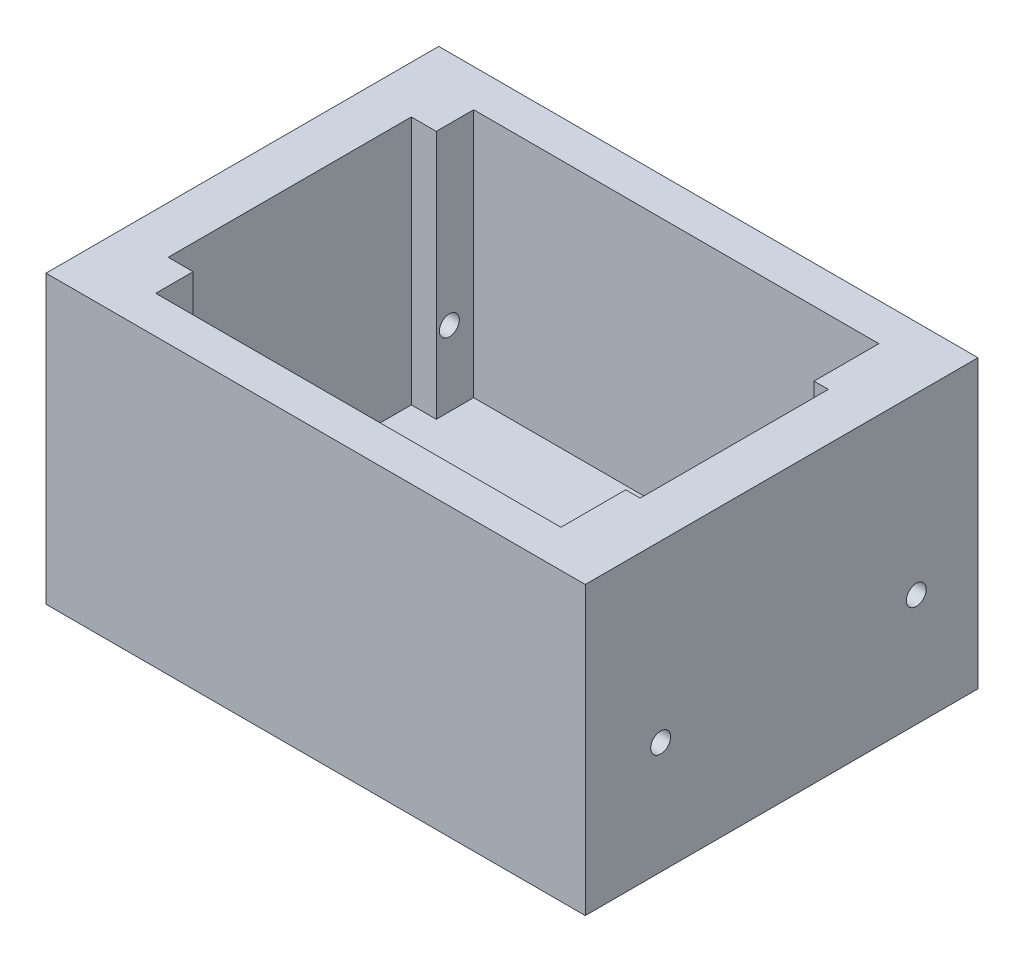
ISO-10303-21;
HEADER;
FILE_DESCRIPTION(('STEP AP214'),'2;1');
FILE_NAME('part.step','',(''),(''),'','','');
FILE_SCHEMA(('AUTOMOTIVE_DESIGN { 1 0 10303 214 1 1 1 1 }'));
ENDSEC;
DATA;
#1=APPLICATION_CONTEXT('core data for automotive mechanical design processes');
#2=APPLICATION_PROTOCOL_DEFINITION('international standard','automotive_design',2000,#1);
#3=PRODUCT_CONTEXT('',#1,'mechanical');
#4=PRODUCT('Part','Part','',(#3));
#5=PRODUCT_RELATED_PRODUCT_CATEGORY('part','',(#4));
#6=PRODUCT_DEFINITION_FORMATION('','',#4);
#7=PRODUCT_DEFINITION_CONTEXT('part definition',#1,'design');
#8=PRODUCT_DEFINITION('design','',#6,#7);
#9=PRODUCT_DEFINITION_SHAPE('','',#8);
#10=(LENGTH_UNIT() NAMED_UNIT(*) SI_UNIT(.MILLI.,.METRE.));
#11=(NAMED_UNIT(*) PLANE_ANGLE_UNIT() SI_UNIT($,.RADIAN.));
#12=(NAMED_UNIT(*) SI_UNIT($,.STERADIAN.) SOLID_ANGLE_UNIT());
#13=UNCERTAINTY_MEASURE_WITH_UNIT(LENGTH_MEASURE(1.E-05),#10,'distance_accuracy_value','');
#14=(GEOMETRIC_REPRESENTATION_CONTEXT(3) GLOBAL_UNCERTAINTY_ASSIGNED_CONTEXT((#13)) GLOBAL_UNIT_ASSIGNED_CONTEXT((#10,
#11,#12)) REPRESENTATION_CONTEXT('',''));
#15=CARTESIAN_POINT('',(0.,0.,0.));
#16=DIRECTION('',(0.,0.,1.));
#17=DIRECTION('',(1.,0.,0.));
#18=AXIS2_PLACEMENT_3D('',#15,#16,#17);
#19=CARTESIAN_POINT('',(3.8,3.,-5.99999999999999));
#20=DIRECTION('',(0.,0.,1.));
#21=DIRECTION('',(1.,0.,0.));
#22=AXIS2_PLACEMENT_3D('',#19,#20,#21);
#23=PLANE('',#22);
#24=DIRECTION('',(0.,1.,0.));
#25=VECTOR('',#24,1.);
#26=CARTESIAN_POINT('',(5.8,3.,-6.));
#27=LINE('',#26,#25);
#28=CARTESIAN_POINT('',(5.8,9.79843597113357,-6.00000000000001));
#29=VERTEX_POINT('',#28);
#30=CARTESIAN_POINT('',(5.8,23.,-6.));
#31=VERTEX_POINT('',#30);
#32=EDGE_CURVE('E178',#29,#31,#27,.T.);
#33=ORIENTED_EDGE('',*,*,#32,.F.);
#34=DIRECTION('',(-1.,0.,0.));
#35=VECTOR('',#34,1.);
#36=CARTESIAN_POINT('',(43.25,9.79843597113357,-6.00000000000001));
#37=LINE('',#36,#35);
#38=CARTESIAN_POINT('',(3.8,9.79843597113357,-5.99999999999999));
#39=VERTEX_POINT('',#38);
#40=EDGE_CURVE('E168',#29,#39,#37,.T.);
#41=ORIENTED_EDGE('',*,*,#40,.T.);
#42=DIRECTION('',(0.,1.,0.));
#43=VECTOR('',#42,1.);
#44=CARTESIAN_POINT('',(3.8,3.,-5.99999999999999));
#45=LINE('',#44,#43);
#46=CARTESIAN_POINT('',(3.8,23.,-5.99999999999999));
#47=VERTEX_POINT('',#46);
#48=EDGE_CURVE('E176',#39,#47,#45,.T.);
#49=ORIENTED_EDGE('',*,*,#48,.T.);
#50=DIRECTION('',(1.,0.,0.));
#51=VECTOR('',#50,1.);
#52=CARTESIAN_POINT('',(3.8,23.,-5.99999999999999));
#53=LINE('',#52,#51);
#54=EDGE_CURVE('E361',#47,#31,#53,.T.);
#55=ORIENTED_EDGE('',*,*,#54,.T.);
#56=EDGE_LOOP('',(#33,#41,#49,#55));
#57=FACE_BOUND('',#56,.T.);
#58=ADVANCED_FACE('F43',(#57),#23,.F.);
#59=CARTESIAN_POINT('',(0.,23.,0.));
#60=DIRECTION('',(1.,0.,0.));
#61=DIRECTION('',(0.,0.,-1.));
#62=AXIS2_PLACEMENT_3D('',#59,#60,#61);
#63=PLANE('',#62);
#64=CARTESIAN_POINT('',(0.,9.,-26.55));
#65=DIRECTION('',(-1.,0.,0.));
#66=DIRECTION('',(0.,0.,1.));
#67=AXIS2_PLACEMENT_3D('',#64,#65,#66);
#68=CIRCLE('',#67,0.799999999999999);
#69=CARTESIAN_POINT('',(0.,9.,-25.75));
#70=VERTEX_POINT('',#69);
#71=EDGE_CURVE('E677',#70,#70,#68,.T.);
#72=ORIENTED_EDGE('',*,*,#71,.F.);
#73=EDGE_LOOP('',(#72));
#74=FACE_BOUND('',#73,.T.);
#75=CARTESIAN_POINT('',(0.,9.,-6.05));
#76=DIRECTION('',(-1.,0.,0.));
#77=DIRECTION('',(0.,0.,1.));
#78=AXIS2_PLACEMENT_3D('',#75,#76,#77);
#79=CIRCLE('',#78,0.800000000000001);
#80=CARTESIAN_POINT('',(0.,9.,-5.25));
#81=VERTEX_POINT('',#80);
#82=EDGE_CURVE('E678',#81,#81,#79,.T.);
#83=ORIENTED_EDGE('',*,*,#82,.F.);
#84=EDGE_LOOP('',(#83));
#85=FACE_BOUND('',#84,.T.);
#86=DIRECTION('',(0.,0.,1.));
#87=VECTOR('',#86,1.);
#88=CARTESIAN_POINT('',(0.,0.,0.));
#89=LINE('',#88,#87);
#90=CARTESIAN_POINT('',(0.,0.,-31.5));
#91=VERTEX_POINT('',#90);
#92=CARTESIAN_POINT('',(0.,0.,0.));
#93=VERTEX_POINT('',#92);
#94=EDGE_CURVE('E216',#91,#93,#89,.T.);
#95=ORIENTED_EDGE('',*,*,#94,.T.);
#96=DIRECTION('',(0.,-1.,0.));
#97=VECTOR('',#96,1.);
#98=CARTESIAN_POINT('',(0.,23.,0.));
#99=LINE('',#98,#97);
#100=CARTESIAN_POINT('',(0.,23.,0.));
#101=VERTEX_POINT('',#100);
#102=EDGE_CURVE('E53',#101,#93,#99,.T.);
#103=ORIENTED_EDGE('',*,*,#102,.F.);
#104=DIRECTION('',(0.,0.,1.));
#105=VECTOR('',#104,1.);
#106=CARTESIAN_POINT('',(0.,23.,0.));
#107=LINE('',#106,#105);
#108=CARTESIAN_POINT('',(0.,23.,-31.5));
#109=VERTEX_POINT('',#108);
#110=EDGE_CURVE('E201',#109,#101,#107,.T.);
#111=ORIENTED_EDGE('',*,*,#110,.F.);
#112=DIRECTION('',(0.,-1.,0.));
#113=VECTOR('',#112,1.);
#114=CARTESIAN_POINT('',(0.,23.,-31.5));
#115=LINE('',#114,#113);
#116=EDGE_CURVE('E215',#109,#91,#115,.T.);
#117=ORIENTED_EDGE('',*,*,#116,.T.);
#118=EDGE_LOOP('',(#95,#103,#111,#117));
#119=FACE_BOUND('',#118,.T.);
#120=ADVANCED_FACE('F45',(#74,#85,#119),#63,.F.);
#121=CARTESIAN_POINT('',(0.,23.,0.));
#122=DIRECTION('',(0.,0.,-1.));
#123=DIRECTION('',(-1.,0.,0.));
#124=AXIS2_PLACEMENT_3D('',#121,#122,#123);
#125=PLANE('',#124);
#126=DIRECTION('',(1.,0.,0.));
#127=VECTOR('',#126,1.);
#128=CARTESIAN_POINT('',(0.,0.,0.));
#129=LINE('',#128,#127);
#130=CARTESIAN_POINT('',(43.25,0.,0.));
#131=VERTEX_POINT('',#130);
#132=EDGE_CURVE('E220',#93,#131,#129,.T.);
#133=ORIENTED_EDGE('',*,*,#132,.T.);
#134=DIRECTION('',(0.,-1.,0.));
#135=VECTOR('',#134,1.);
#136=CARTESIAN_POINT('',(43.25,23.,0.));
#137=LINE('',#136,#135);
#138=CARTESIAN_POINT('',(43.25,23.,0.));
#139=VERTEX_POINT('',#138);
#140=EDGE_CURVE('E236',#139,#131,#137,.T.);
#141=ORIENTED_EDGE('',*,*,#140,.F.);
#142=DIRECTION('',(1.,0.,0.));
#143=VECTOR('',#142,1.);
#144=CARTESIAN_POINT('',(0.,23.,0.));
#145=LINE('',#144,#143);
#146=EDGE_CURVE('E205',#101,#139,#145,.T.);
#147=ORIENTED_EDGE('',*,*,#146,.F.);
#148=ORIENTED_EDGE('',*,*,#102,.T.);
#149=EDGE_LOOP('',(#133,#141,#147,#148));
#150=FACE_BOUND('',#149,.T.);
#151=ADVANCED_FACE('F244',(#150),#125,.F.);
#152=CARTESIAN_POINT('',(43.25,23.,0.));
#153=DIRECTION('',(-1.,0.,0.));
#154=DIRECTION('',(0.,0.,1.));
#155=AXIS2_PLACEMENT_3D('',#152,#153,#154);
#156=PLANE('',#155);
#157=CARTESIAN_POINT('',(43.25,9.,-26.55));
#158=DIRECTION('',(-1.,0.,0.));
#159=DIRECTION('',(0.,0.,1.));
#160=AXIS2_PLACEMENT_3D('',#157,#158,#159);
#161=CIRCLE('',#160,0.799999999999999);
#162=CARTESIAN_POINT('',(43.25,9.,-25.75));
#163=VERTEX_POINT('',#162);
#164=EDGE_CURVE('E672',#163,#163,#161,.T.);
#165=ORIENTED_EDGE('',*,*,#164,.T.);
#166=EDGE_LOOP('',(#165));
#167=FACE_BOUND('',#166,.T.);
#168=CARTESIAN_POINT('',(43.25,9.,-6.05));
#169=DIRECTION('',(-1.,0.,0.));
#170=DIRECTION('',(0.,0.,1.));
#171=AXIS2_PLACEMENT_3D('',#168,#169,#170);
#172=CIRCLE('',#171,0.800000000000001);
#173=CARTESIAN_POINT('',(43.25,9.,-5.25));
#174=VERTEX_POINT('',#173);
#175=EDGE_CURVE('E675',#174,#174,#172,.T.);
#176=ORIENTED_EDGE('',*,*,#175,.T.);
#177=EDGE_LOOP('',(#176));
#178=FACE_BOUND('',#177,.T.);
#179=DIRECTION('',(0.,0.,-1.));
#180=VECTOR('',#179,1.);
#181=CARTESIAN_POINT('',(43.25,0.,0.));
#182=LINE('',#181,#180);
#183=CARTESIAN_POINT('',(43.25,0.,-31.5));
#184=VERTEX_POINT('',#183);
#185=EDGE_CURVE('E224',#131,#184,#182,.T.);
#186=ORIENTED_EDGE('',*,*,#185,.T.);
#187=DIRECTION('',(0.,-1.,0.));
#188=VECTOR('',#187,1.);
#189=CARTESIAN_POINT('',(43.25,23.,-31.5));
#190=LINE('',#189,#188);
#191=CARTESIAN_POINT('',(43.25,23.,-31.5));
#192=VERTEX_POINT('',#191);
#193=EDGE_CURVE('E232',#192,#184,#190,.T.);
#194=ORIENTED_EDGE('',*,*,#193,.F.);
#195=DIRECTION('',(0.,0.,-1.));
#196=VECTOR('',#195,1.);
#197=CARTESIAN_POINT('',(43.25,23.,0.));
#198=LINE('',#197,#196);
#199=EDGE_CURVE('E209',#139,#192,#198,.T.);
#200=ORIENTED_EDGE('',*,*,#199,.F.);
#201=ORIENTED_EDGE('',*,*,#140,.T.);
#202=EDGE_LOOP('',(#186,#194,#200,#201));
#203=FACE_BOUND('',#202,.T.);
#204=ADVANCED_FACE('F256',(#167,#178,#203),#156,.F.);
#205=CARTESIAN_POINT('',(0.,23.,-31.5));
#206=DIRECTION('',(0.,0.,1.));
#207=DIRECTION('',(1.,0.,0.));
#208=AXIS2_PLACEMENT_3D('',#205,#206,#207);
#209=PLANE('',#208);
#210=DIRECTION('',(-1.,0.,0.));
#211=VECTOR('',#210,1.);
#212=CARTESIAN_POINT('',(0.,0.,-31.5));
#213=LINE('',#212,#211);
#214=EDGE_CURVE('E206',#184,#91,#213,.T.);
#215=ORIENTED_EDGE('',*,*,#214,.T.);
#216=ORIENTED_EDGE('',*,*,#116,.F.);
#217=DIRECTION('',(-1.,0.,0.));
#218=VECTOR('',#217,1.);
#219=CARTESIAN_POINT('',(0.,23.,-31.5));
#220=LINE('',#219,#218);
#221=EDGE_CURVE('E212',#192,#109,#220,.T.);
#222=ORIENTED_EDGE('',*,*,#221,.F.);
#223=ORIENTED_EDGE('',*,*,#193,.T.);
#224=EDGE_LOOP('',(#215,#216,#222,#223));
#225=FACE_BOUND('',#224,.T.);
#226=ADVANCED_FACE('F260',(#225),#209,.F.);
#227=CARTESIAN_POINT('',(0.,23.,0.));
#228=DIRECTION('',(0.,-1.,0.));
#229=DIRECTION('',(0.,0.,-1.));
#230=AXIS2_PLACEMENT_3D('',#227,#228,#229);
#231=PLANE('',#230);
#232=DIRECTION('',(-1.,0.,0.));
#233=VECTOR('',#232,1.);
#234=CARTESIAN_POINT('',(5.8,23.,-25.5));
#235=LINE('',#234,#233);
#236=CARTESIAN_POINT('',(5.8,23.,-25.5));
#237=VERTEX_POINT('',#236);
#238=CARTESIAN_POINT('',(3.8,23.,-25.5));
#239=VERTEX_POINT('',#238);
#240=EDGE_CURVE('E355',#237,#239,#235,.T.);
#241=ORIENTED_EDGE('',*,*,#240,.F.);
#242=DIRECTION('',(0.,0.,1.));
#243=VECTOR('',#242,1.);
#244=CARTESIAN_POINT('',(5.8,23.,-28.5));
#245=LINE('',#244,#243);
#246=CARTESIAN_POINT('',(5.8,23.,-28.5));
#247=VERTEX_POINT('',#246);
#248=EDGE_CURVE('E67',#247,#237,#245,.T.);
#249=ORIENTED_EDGE('',*,*,#248,.F.);
#250=DIRECTION('',(-1.,0.,0.));
#251=VECTOR('',#250,1.);
#252=CARTESIAN_POINT('',(38.3,23.,-28.5));
#253=LINE('',#252,#251);
#254=CARTESIAN_POINT('',(38.3,23.,-28.5));
#255=VERTEX_POINT('',#254);
#256=EDGE_CURVE('E317',#255,#247,#253,.T.);
#257=ORIENTED_EDGE('',*,*,#256,.F.);
#258=DIRECTION('',(0.,0.,-1.));
#259=VECTOR('',#258,1.);
#260=CARTESIAN_POINT('',(38.3,23.,-23.3));
#261=LINE('',#260,#259);
#262=CARTESIAN_POINT('',(38.3,23.,-23.3));
#263=VERTEX_POINT('',#262);
#264=EDGE_CURVE('E388',#263,#255,#261,.T.);
#265=ORIENTED_EDGE('',*,*,#264,.F.);
#266=DIRECTION('',(-1.,0.,0.));
#267=VECTOR('',#266,1.);
#268=CARTESIAN_POINT('',(39.45,23.,-23.3));
#269=LINE('',#268,#267);
#270=CARTESIAN_POINT('',(39.45,23.,-23.3));
#271=VERTEX_POINT('',#270);
#272=EDGE_CURVE('E384',#271,#263,#269,.T.);
#273=ORIENTED_EDGE('',*,*,#272,.F.);
#274=DIRECTION('',(0.,0.,-1.));
#275=VECTOR('',#274,1.);
#276=CARTESIAN_POINT('',(39.45,23.,-8.2));
#277=LINE('',#276,#275);
#278=CARTESIAN_POINT('',(39.45,23.,-8.2));
#279=VERTEX_POINT('',#278);
#280=EDGE_CURVE('E380',#279,#271,#277,.T.);
#281=ORIENTED_EDGE('',*,*,#280,.F.);
#282=DIRECTION('',(1.,0.,0.));
#283=VECTOR('',#282,1.);
#284=CARTESIAN_POINT('',(38.3,23.,-8.2));
#285=LINE('',#284,#283);
#286=CARTESIAN_POINT('',(38.3,23.,-8.2));
#287=VERTEX_POINT('',#286);
#288=EDGE_CURVE('E376',#287,#279,#285,.T.);
#289=ORIENTED_EDGE('',*,*,#288,.F.);
#290=DIRECTION('',(0.,0.,-1.));
#291=VECTOR('',#290,1.);
#292=CARTESIAN_POINT('',(38.3,23.,-3.));
#293=LINE('',#292,#291);
#294=CARTESIAN_POINT('',(38.3,23.,-3.));
#295=VERTEX_POINT('',#294);
#296=EDGE_CURVE('E372',#295,#287,#293,.T.);
#297=ORIENTED_EDGE('',*,*,#296,.F.);
#298=DIRECTION('',(1.,0.,0.));
#299=VECTOR('',#298,1.);
#300=CARTESIAN_POINT('',(5.8,23.,-3.));
#301=LINE('',#300,#299);
#302=CARTESIAN_POINT('',(5.8,23.,-3.));
#303=VERTEX_POINT('',#302);
#304=EDGE_CURVE('E368',#303,#295,#301,.T.);
#305=ORIENTED_EDGE('',*,*,#304,.F.);
#306=DIRECTION('',(0.,0.,1.));
#307=VECTOR('',#306,1.);
#308=CARTESIAN_POINT('',(5.8,23.,-6.));
#309=LINE('',#308,#307);
#310=EDGE_CURVE('E364',#31,#303,#309,.T.);
#311=ORIENTED_EDGE('',*,*,#310,.F.);
#312=ORIENTED_EDGE('',*,*,#54,.F.);
#313=DIRECTION('',(0.,0.,1.));
#314=VECTOR('',#313,1.);
#315=CARTESIAN_POINT('',(3.8,23.,-25.5));
#316=LINE('',#315,#314);
#317=EDGE_CURVE('E184',#239,#47,#316,.T.);
#318=ORIENTED_EDGE('',*,*,#317,.F.);
#319=EDGE_LOOP('',(#241,#249,#257,#265,#273,#281,#289,#297,#305,#311,#312,#318));
#320=FACE_BOUND('',#319,.T.);
#321=ORIENTED_EDGE('',*,*,#110,.T.);
#322=ORIENTED_EDGE('',*,*,#146,.T.);
#323=ORIENTED_EDGE('',*,*,#199,.T.);
#324=ORIENTED_EDGE('',*,*,#221,.T.);
#325=EDGE_LOOP('',(#321,#322,#323,#324));
#326=FACE_BOUND('',#325,.T.);
#327=ADVANCED_FACE('F262',(#320,#326),#231,.F.);
#328=CARTESIAN_POINT('',(0.,0.,0.));
#329=DIRECTION('',(0.,-1.,0.));
#330=DIRECTION('',(0.,0.,-1.));
#331=AXIS2_PLACEMENT_3D('',#328,#329,#330);
#332=PLANE('',#331);
#333=ORIENTED_EDGE('',*,*,#94,.F.);
#334=ORIENTED_EDGE('',*,*,#214,.F.);
#335=ORIENTED_EDGE('',*,*,#185,.F.);
#336=ORIENTED_EDGE('',*,*,#132,.F.);
#337=EDGE_LOOP('',(#333,#334,#335,#336));
#338=FACE_BOUND('',#337,.T.);
#339=ADVANCED_FACE('F252',(#338),#332,.T.);
#340=CARTESIAN_POINT('',(5.8,3.,-28.5));
#341=DIRECTION('',(-1.,0.,0.));
#342=DIRECTION('',(0.,0.,1.));
#343=AXIS2_PLACEMENT_3D('',#340,#341,#342);
#344=PLANE('',#343);
#345=CARTESIAN_POINT('',(5.8,9.,-26.55));
#346=DIRECTION('',(-1.,0.,0.));
#347=DIRECTION('',(0.,0.,1.));
#348=AXIS2_PLACEMENT_3D('',#345,#346,#347);
#349=CIRCLE('',#348,0.799999999999999);
#350=CARTESIAN_POINT('',(5.8,9.,-25.75));
#351=VERTEX_POINT('',#350);
#352=EDGE_CURVE('E356',#351,#351,#349,.T.);
#353=ORIENTED_EDGE('',*,*,#352,.T.);
#354=EDGE_LOOP('',(#353));
#355=FACE_BOUND('',#354,.T.);
#356=ORIENTED_EDGE('',*,*,#248,.T.);
#357=DIRECTION('',(0.,1.,0.));
#358=VECTOR('',#357,1.);
#359=CARTESIAN_POINT('',(5.8,3.,-25.5));
#360=LINE('',#359,#358);
#361=CARTESIAN_POINT('',(5.8,3.,-25.5));
#362=VERTEX_POINT('',#361);
#363=EDGE_CURVE('E192',#362,#237,#360,.T.);
#364=ORIENTED_EDGE('',*,*,#363,.F.);
#365=DIRECTION('',(0.,0.,1.));
#366=VECTOR('',#365,1.);
#367=CARTESIAN_POINT('',(5.8,3.,-28.5));
#368=LINE('',#367,#366);
#369=CARTESIAN_POINT('',(5.8,3.,-28.5));
#370=VERTEX_POINT('',#369);
#371=EDGE_CURVE('E312',#370,#362,#368,.T.);
#372=ORIENTED_EDGE('',*,*,#371,.F.);
#373=DIRECTION('',(0.,1.,0.));
#374=VECTOR('',#373,1.);
#375=CARTESIAN_POINT('',(5.8,3.,-28.5));
#376=LINE('',#375,#374);
#377=EDGE_CURVE('E221',#370,#247,#376,.T.);
#378=ORIENTED_EDGE('',*,*,#377,.T.);
#379=EDGE_LOOP('',(#356,#364,#372,#378));
#380=FACE_BOUND('',#379,.T.);
#381=ADVANCED_FACE('F270',(#355,#380),#344,.F.);
#382=CARTESIAN_POINT('',(38.3,3.,-28.5));
#383=DIRECTION('',(0.,0.,-1.));
#384=DIRECTION('',(-1.,0.,0.));
#385=AXIS2_PLACEMENT_3D('',#382,#383,#384);
#386=PLANE('',#385);
#387=ORIENTED_EDGE('',*,*,#256,.T.);
#388=ORIENTED_EDGE('',*,*,#377,.F.);
#389=DIRECTION('',(-1.,0.,0.));
#390=VECTOR('',#389,1.);
#391=CARTESIAN_POINT('',(38.3,3.,-28.5));
#392=LINE('',#391,#390);
#393=CARTESIAN_POINT('',(38.3,3.,-28.5));
#394=VERTEX_POINT('',#393);
#395=EDGE_CURVE('E200',#394,#370,#392,.T.);
#396=ORIENTED_EDGE('',*,*,#395,.F.);
#397=DIRECTION('',(0.,1.,0.));
#398=VECTOR('',#397,1.);
#399=CARTESIAN_POINT('',(38.3,3.,-28.5));
#400=LINE('',#399,#398);
#401=EDGE_CURVE('E397',#394,#255,#400,.T.);
#402=ORIENTED_EDGE('',*,*,#401,.T.);
#403=EDGE_LOOP('',(#387,#388,#396,#402));
#404=FACE_BOUND('',#403,.T.);
#405=ADVANCED_FACE('F443',(#404),#386,.F.);
#406=CARTESIAN_POINT('',(38.3,3.,-23.3));
#407=DIRECTION('',(1.,0.,0.));
#408=DIRECTION('',(0.,0.,-1.));
#409=AXIS2_PLACEMENT_3D('',#406,#407,#408);
#410=PLANE('',#409);
#411=CARTESIAN_POINT('',(38.3,9.,-26.55));
#412=DIRECTION('',(1.,0.,0.));
#413=DIRECTION('',(0.,0.,-1.));
#414=AXIS2_PLACEMENT_3D('',#411,#412,#413);
#415=CIRCLE('',#414,0.799999999999999);
#416=CARTESIAN_POINT('',(38.3,9.,-27.35));
#417=VERTEX_POINT('',#416);
#418=EDGE_CURVE('E47',#417,#417,#415,.T.);
#419=ORIENTED_EDGE('',*,*,#418,.T.);
#420=EDGE_LOOP('',(#419));
#421=FACE_BOUND('',#420,.T.);
#422=ORIENTED_EDGE('',*,*,#264,.T.);
#423=ORIENTED_EDGE('',*,*,#401,.F.);
#424=DIRECTION('',(0.,0.,-1.));
#425=VECTOR('',#424,1.);
#426=CARTESIAN_POINT('',(38.3,3.,-23.3));
#427=LINE('',#426,#425);
#428=CARTESIAN_POINT('',(38.3,3.,-23.3));
#429=VERTEX_POINT('',#428);
#430=EDGE_CURVE('E347',#429,#394,#427,.T.);
#431=ORIENTED_EDGE('',*,*,#430,.F.);
#432=DIRECTION('',(0.,1.,0.));
#433=VECTOR('',#432,1.);
#434=CARTESIAN_POINT('',(38.3,3.,-23.3));
#435=LINE('',#434,#433);
#436=EDGE_CURVE('E400',#429,#263,#435,.T.);
#437=ORIENTED_EDGE('',*,*,#436,.T.);
#438=EDGE_LOOP('',(#422,#423,#431,#437));
#439=FACE_BOUND('',#438,.T.);
#440=ADVANCED_FACE('F446',(#421,#439),#410,.F.);
#441=CARTESIAN_POINT('',(39.45,3.,-23.3));
#442=DIRECTION('',(0.,0.,-1.));
#443=DIRECTION('',(-1.,0.,0.));
#444=AXIS2_PLACEMENT_3D('',#441,#442,#443);
#445=PLANE('',#444);
#446=ORIENTED_EDGE('',*,*,#272,.T.);
#447=ORIENTED_EDGE('',*,*,#436,.F.);
#448=DIRECTION('',(-1.,0.,0.));
#449=VECTOR('',#448,1.);
#450=CARTESIAN_POINT('',(39.45,3.,-23.3));
#451=LINE('',#450,#449);
#452=CARTESIAN_POINT('',(39.45,3.,-23.3));
#453=VERTEX_POINT('',#452);
#454=EDGE_CURVE('E343',#453,#429,#451,.T.);
#455=ORIENTED_EDGE('',*,*,#454,.F.);
#456=DIRECTION('',(0.,1.,0.));
#457=VECTOR('',#456,1.);
#458=CARTESIAN_POINT('',(39.45,3.,-23.3));
#459=LINE('',#458,#457);
#460=EDGE_CURVE('E403',#453,#271,#459,.T.);
#461=ORIENTED_EDGE('',*,*,#460,.T.);
#462=EDGE_LOOP('',(#446,#447,#455,#461));
#463=FACE_BOUND('',#462,.T.);
#464=ADVANCED_FACE('F438',(#463),#445,.F.);
#465=CARTESIAN_POINT('',(39.45,3.,-8.2));
#466=DIRECTION('',(1.,0.,0.));
#467=DIRECTION('',(0.,0.,-1.));
#468=AXIS2_PLACEMENT_3D('',#465,#466,#467);
#469=PLANE('',#468);
#470=ORIENTED_EDGE('',*,*,#280,.T.);
#471=ORIENTED_EDGE('',*,*,#460,.F.);
#472=DIRECTION('',(0.,0.,-1.));
#473=VECTOR('',#472,1.);
#474=CARTESIAN_POINT('',(39.45,3.,-8.2));
#475=LINE('',#474,#473);
#476=CARTESIAN_POINT('',(39.45,3.,-8.2));
#477=VERTEX_POINT('',#476);
#478=EDGE_CURVE('E339',#477,#453,#475,.T.);
#479=ORIENTED_EDGE('',*,*,#478,.F.);
#480=DIRECTION('',(0.,1.,0.));
#481=VECTOR('',#480,1.);
#482=CARTESIAN_POINT('',(39.45,3.,-8.2));
#483=LINE('',#482,#481);
#484=EDGE_CURVE('E406',#477,#279,#483,.T.);
#485=ORIENTED_EDGE('',*,*,#484,.T.);
#486=EDGE_LOOP('',(#470,#471,#479,#485));
#487=FACE_BOUND('',#486,.T.);
#488=ADVANCED_FACE('F434',(#487),#469,.F.);
#489=CARTESIAN_POINT('',(38.3,3.,-8.2));
#490=DIRECTION('',(0.,0.,1.));
#491=DIRECTION('',(1.,0.,0.));
#492=AXIS2_PLACEMENT_3D('',#489,#490,#491);
#493=PLANE('',#492);
#494=ORIENTED_EDGE('',*,*,#288,.T.);
#495=ORIENTED_EDGE('',*,*,#484,.F.);
#496=DIRECTION('',(1.,0.,0.));
#497=VECTOR('',#496,1.);
#498=CARTESIAN_POINT('',(38.3,3.,-8.2));
#499=LINE('',#498,#497);
#500=CARTESIAN_POINT('',(38.3,3.,-8.2));
#501=VERTEX_POINT('',#500);
#502=EDGE_CURVE('E335',#501,#477,#499,.T.);
#503=ORIENTED_EDGE('',*,*,#502,.F.);
#504=DIRECTION('',(0.,1.,0.));
#505=VECTOR('',#504,1.);
#506=CARTESIAN_POINT('',(38.3,3.,-8.2));
#507=LINE('',#506,#505);
#508=EDGE_CURVE('E409',#501,#287,#507,.T.);
#509=ORIENTED_EDGE('',*,*,#508,.T.);
#510=EDGE_LOOP('',(#494,#495,#503,#509));
#511=FACE_BOUND('',#510,.T.);
#512=ADVANCED_FACE('F431',(#511),#493,.F.);
#513=CARTESIAN_POINT('',(38.3,3.,-3.));
#514=DIRECTION('',(1.,0.,0.));
#515=DIRECTION('',(0.,0.,-1.));
#516=AXIS2_PLACEMENT_3D('',#513,#514,#515);
#517=PLANE('',#516);
#518=CARTESIAN_POINT('',(38.3,9.,-6.05));
#519=DIRECTION('',(1.,0.,0.));
#520=DIRECTION('',(0.,0.,-1.));
#521=AXIS2_PLACEMENT_3D('',#518,#519,#520);
#522=CIRCLE('',#521,0.800000000000001);
#523=CARTESIAN_POINT('',(38.3,9.,-6.85));
#524=VERTEX_POINT('',#523);
#525=EDGE_CURVE('E692',#524,#524,#522,.T.);
#526=ORIENTED_EDGE('',*,*,#525,.T.);
#527=EDGE_LOOP('',(#526));
#528=FACE_BOUND('',#527,.T.);
#529=ORIENTED_EDGE('',*,*,#296,.T.);
#530=ORIENTED_EDGE('',*,*,#508,.F.);
#531=DIRECTION('',(0.,0.,-1.));
#532=VECTOR('',#531,1.);
#533=CARTESIAN_POINT('',(38.3,3.,-3.));
#534=LINE('',#533,#532);
#535=CARTESIAN_POINT('',(38.3,3.,-3.));
#536=VERTEX_POINT('',#535);
#537=EDGE_CURVE('E331',#536,#501,#534,.T.);
#538=ORIENTED_EDGE('',*,*,#537,.F.);
#539=DIRECTION('',(0.,1.,0.));
#540=VECTOR('',#539,1.);
#541=CARTESIAN_POINT('',(38.3,3.,-3.));
#542=LINE('',#541,#540);
#543=EDGE_CURVE('E412',#536,#295,#542,.T.);
#544=ORIENTED_EDGE('',*,*,#543,.T.);
#545=EDGE_LOOP('',(#529,#530,#538,#544));
#546=FACE_BOUND('',#545,.T.);
#547=ADVANCED_FACE('F427',(#528,#546),#517,.F.);
#548=CARTESIAN_POINT('',(5.8,3.,-3.));
#549=DIRECTION('',(0.,0.,1.));
#550=DIRECTION('',(1.,0.,0.));
#551=AXIS2_PLACEMENT_3D('',#548,#549,#550);
#552=PLANE('',#551);
#553=ORIENTED_EDGE('',*,*,#304,.T.);
#554=ORIENTED_EDGE('',*,*,#543,.F.);
#555=DIRECTION('',(1.,0.,0.));
#556=VECTOR('',#555,1.);
#557=CARTESIAN_POINT('',(5.8,3.,-3.));
#558=LINE('',#557,#556);
#559=CARTESIAN_POINT('',(5.8,3.,-3.));
#560=VERTEX_POINT('',#559);
#561=EDGE_CURVE('E327',#560,#536,#558,.T.);
#562=ORIENTED_EDGE('',*,*,#561,.F.);
#563=DIRECTION('',(0.,1.,0.));
#564=VECTOR('',#563,1.);
#565=CARTESIAN_POINT('',(5.8,3.,-3.));
#566=LINE('',#565,#564);
#567=EDGE_CURVE('E414',#560,#303,#566,.T.);
#568=ORIENTED_EDGE('',*,*,#567,.T.);
#569=EDGE_LOOP('',(#553,#554,#562,#568));
#570=FACE_BOUND('',#569,.T.);
#571=ADVANCED_FACE('F292',(#570),#552,.F.);
#572=CARTESIAN_POINT('',(5.8,3.,-6.));
#573=DIRECTION('',(-1.,0.,0.));
#574=DIRECTION('',(0.,0.,1.));
#575=AXIS2_PLACEMENT_3D('',#572,#573,#574);
#576=PLANE('',#575);
#577=CARTESIAN_POINT('',(5.8,3.,-6.));
#578=VERTEX_POINT('',#577);
#579=CARTESIAN_POINT('',(5.8,8.20156402886643,-6.00000000000001));
#580=VERTEX_POINT('',#579);
#581=EDGE_CURVE('E195',#578,#580,#27,.T.);
#582=ORIENTED_EDGE('',*,*,#581,.T.);
#583=CARTESIAN_POINT('',(5.8,9.,-6.05));
#584=DIRECTION('',(-1.,0.,0.));
#585=DIRECTION('',(0.,0.,1.));
#586=AXIS2_PLACEMENT_3D('',#583,#584,#585);
#587=CIRCLE('',#586,0.800000000000001);
#588=EDGE_CURVE('E180',#580,#29,#587,.T.);
#589=ORIENTED_EDGE('',*,*,#588,.T.);
#590=ORIENTED_EDGE('',*,*,#32,.T.);
#591=ORIENTED_EDGE('',*,*,#310,.T.);
#592=ORIENTED_EDGE('',*,*,#567,.F.);
#593=DIRECTION('',(0.,0.,1.));
#594=VECTOR('',#593,1.);
#595=CARTESIAN_POINT('',(5.8,3.,-6.));
#596=LINE('',#595,#594);
#597=EDGE_CURVE('E323',#578,#560,#596,.T.);
#598=ORIENTED_EDGE('',*,*,#597,.F.);
#599=EDGE_LOOP('',(#582,#589,#590,#591,#592,#598));
#600=FACE_BOUND('',#599,.T.);
#601=ADVANCED_FACE('F285',(#600),#576,.F.);
#602=CARTESIAN_POINT('',(3.8,3.,-5.99999999999999));
#603=VERTEX_POINT('',#602);
#604=CARTESIAN_POINT('',(3.8,8.20156402886644,-5.99999999999999));
#605=VERTEX_POINT('',#604);
#606=EDGE_CURVE('E187',#603,#605,#45,.T.);
#607=ORIENTED_EDGE('',*,*,#606,.T.);
#608=DIRECTION('',(-1.,0.,0.));
#609=VECTOR('',#608,1.);
#610=CARTESIAN_POINT('',(43.25,8.20156402886643,-6.00000000000001));
#611=LINE('',#610,#609);
#612=EDGE_CURVE('E60',#605,#580,#611,.F.);
#613=ORIENTED_EDGE('',*,*,#612,.T.);
#614=ORIENTED_EDGE('',*,*,#581,.F.);
#615=DIRECTION('',(1.,0.,0.));
#616=VECTOR('',#615,1.);
#617=CARTESIAN_POINT('',(3.8,3.,-5.99999999999999));
#618=LINE('',#617,#616);
#619=EDGE_CURVE('E297',#603,#578,#618,.T.);
#620=ORIENTED_EDGE('',*,*,#619,.F.);
#621=EDGE_LOOP('',(#607,#613,#614,#620));
#622=FACE_BOUND('',#621,.T.);
#623=ADVANCED_FACE('F277',(#622),#23,.F.);
#624=CARTESIAN_POINT('',(3.8,3.,-25.5));
#625=DIRECTION('',(-1.,0.,0.));
#626=DIRECTION('',(0.,0.,1.));
#627=AXIS2_PLACEMENT_3D('',#624,#625,#626);
#628=PLANE('',#627);
#629=ORIENTED_EDGE('',*,*,#48,.F.);
#630=CARTESIAN_POINT('',(3.8,9.,-6.05));
#631=DIRECTION('',(-1.,0.,0.));
#632=DIRECTION('',(0.,0.,1.));
#633=AXIS2_PLACEMENT_3D('',#630,#631,#632);
#634=CIRCLE('',#633,0.800000000000001);
#635=EDGE_CURVE('E11',#39,#605,#634,.T.);
#636=ORIENTED_EDGE('',*,*,#635,.T.);
#637=ORIENTED_EDGE('',*,*,#606,.F.);
#638=DIRECTION('',(0.,0.,1.));
#639=VECTOR('',#638,1.);
#640=CARTESIAN_POINT('',(3.8,3.,-25.5));
#641=LINE('',#640,#639);
#642=CARTESIAN_POINT('',(3.8,3.,-25.5));
#643=VERTEX_POINT('',#642);
#644=EDGE_CURVE('E300',#643,#603,#641,.T.);
#645=ORIENTED_EDGE('',*,*,#644,.F.);
#646=DIRECTION('',(0.,1.,0.));
#647=VECTOR('',#646,1.);
#648=CARTESIAN_POINT('',(3.8,3.,-25.5));
#649=LINE('',#648,#647);
#650=EDGE_CURVE('E188',#643,#239,#649,.T.);
#651=ORIENTED_EDGE('',*,*,#650,.T.);
#652=ORIENTED_EDGE('',*,*,#317,.T.);
#653=EDGE_LOOP('',(#629,#636,#637,#645,#651,#652));
#654=FACE_BOUND('',#653,.T.);
#655=ADVANCED_FACE('F182',(#654),#628,.F.);
#656=CARTESIAN_POINT('',(5.8,3.,-25.5));
#657=DIRECTION('',(0.,0.,-1.));
#658=DIRECTION('',(-1.,0.,0.));
#659=AXIS2_PLACEMENT_3D('',#656,#657,#658);
#660=PLANE('',#659);
#661=ORIENTED_EDGE('',*,*,#240,.T.);
#662=ORIENTED_EDGE('',*,*,#650,.F.);
#663=DIRECTION('',(-1.,0.,0.));
#664=VECTOR('',#663,1.);
#665=CARTESIAN_POINT('',(5.8,3.,-25.5));
#666=LINE('',#665,#664);
#667=EDGE_CURVE('E305',#362,#643,#666,.T.);
#668=ORIENTED_EDGE('',*,*,#667,.F.);
#669=ORIENTED_EDGE('',*,*,#363,.T.);
#670=EDGE_LOOP('',(#661,#662,#668,#669));
#671=FACE_BOUND('',#670,.T.);
#672=ADVANCED_FACE('F291',(#671),#660,.F.);
#673=CARTESIAN_POINT('',(0.,3.,0.));
#674=DIRECTION('',(0.,-1.,0.));
#675=DIRECTION('',(0.,0.,-1.));
#676=AXIS2_PLACEMENT_3D('',#673,#674,#675);
#677=PLANE('',#676);
#678=ORIENTED_EDGE('',*,*,#371,.T.);
#679=ORIENTED_EDGE('',*,*,#667,.T.);
#680=ORIENTED_EDGE('',*,*,#644,.T.);
#681=ORIENTED_EDGE('',*,*,#619,.T.);
#682=ORIENTED_EDGE('',*,*,#597,.T.);
#683=ORIENTED_EDGE('',*,*,#561,.T.);
#684=ORIENTED_EDGE('',*,*,#537,.T.);
#685=ORIENTED_EDGE('',*,*,#502,.T.);
#686=ORIENTED_EDGE('',*,*,#478,.T.);
#687=ORIENTED_EDGE('',*,*,#454,.T.);
#688=ORIENTED_EDGE('',*,*,#430,.T.);
#689=ORIENTED_EDGE('',*,*,#395,.T.);
#690=EDGE_LOOP('',(#678,#679,#680,#681,#682,#683,#684,#685,#686,#687,#688,#689));
#691=FACE_BOUND('',#690,.T.);
#692=ADVANCED_FACE('F309',(#691),#677,.F.);
#693=CARTESIAN_POINT('',(43.25,9.,-6.05));
#694=DIRECTION('',(-1.,0.,0.));
#695=DIRECTION('',(0.,0.,1.));
#696=AXIS2_PLACEMENT_3D('',#693,#694,#695);
#697=CYLINDRICAL_SURFACE('',#696,0.800000000000001);
#698=ORIENTED_EDGE('',*,*,#82,.T.);
#699=EDGE_LOOP('',(#698));
#700=FACE_BOUND('',#699,.T.);
#701=ORIENTED_EDGE('',*,*,#612,.F.);
#702=ORIENTED_EDGE('',*,*,#635,.F.);
#703=ORIENTED_EDGE('',*,*,#40,.F.);
#704=ORIENTED_EDGE('',*,*,#588,.F.);
#705=EDGE_LOOP('',(#701,#702,#703,#704));
#706=FACE_BOUND('',#705,.T.);
#707=ADVANCED_FACE('F167',(#700,#706),#697,.F.);
#708=ORIENTED_EDGE('',*,*,#175,.F.);
#709=EDGE_LOOP('',(#708));
#710=FACE_BOUND('',#709,.T.);
#711=ORIENTED_EDGE('',*,*,#525,.F.);
#712=EDGE_LOOP('',(#711));
#713=FACE_BOUND('',#712,.T.);
#714=ADVANCED_FACE('F503',(#710,#713),#697,.F.);
#715=CARTESIAN_POINT('',(43.25,9.,-26.55));
#716=DIRECTION('',(-1.,0.,0.));
#717=DIRECTION('',(0.,0.,1.));
#718=AXIS2_PLACEMENT_3D('',#715,#716,#717);
#719=CYLINDRICAL_SURFACE('',#718,0.799999999999999);
#720=ORIENTED_EDGE('',*,*,#164,.F.);
#721=EDGE_LOOP('',(#720));
#722=FACE_BOUND('',#721,.T.);
#723=ORIENTED_EDGE('',*,*,#418,.F.);
#724=EDGE_LOOP('',(#723));
#725=FACE_BOUND('',#724,.T.);
#726=ADVANCED_FACE('F516',(#722,#725),#719,.F.);
#727=ORIENTED_EDGE('',*,*,#71,.T.);
#728=EDGE_LOOP('',(#727));
#729=FACE_BOUND('',#728,.T.);
#730=ORIENTED_EDGE('',*,*,#352,.F.);
#731=EDGE_LOOP('',(#730));
#732=FACE_BOUND('',#731,.T.);
#733=ADVANCED_FACE('F526',(#729,#732),#719,.F.);
#734=CLOSED_SHELL('',(#58,#120,#151,#204,#226,#327,#339,#381,#405,#440,#464,#488,#512,#547,#571,
#601,#623,#655,#672,#692,#707,#714,#726,#733));
#735=MANIFOLD_SOLID_BREP('B2',#734);
#736=ADVANCED_BREP_SHAPE_REPRESENTATION('',(#18,#735),#14);
#737=SHAPE_DEFINITION_REPRESENTATION(#9,#736);
ENDSEC;
END-ISO-10303-21;
